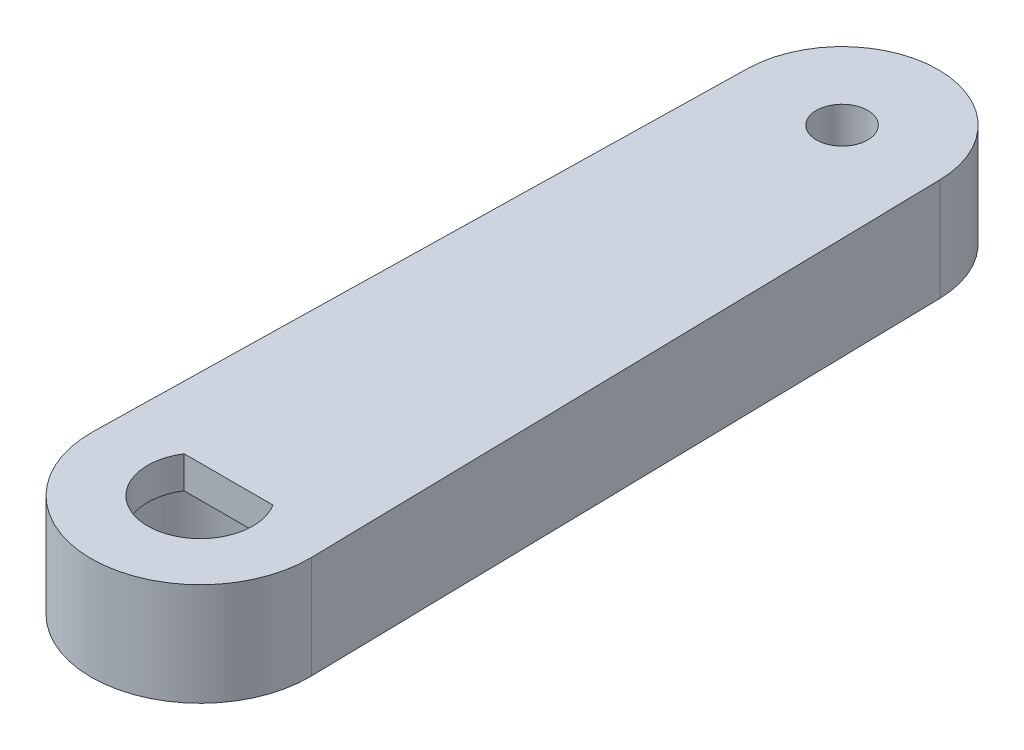
ISO-10303-21;
HEADER;
FILE_DESCRIPTION(('STEP AP214'),'2;1');
FILE_NAME('part.step','',(''),(''),'','','');
FILE_SCHEMA(('AUTOMOTIVE_DESIGN { 1 0 10303 214 1 1 1 1 }'));
ENDSEC;
DATA;
#1=APPLICATION_CONTEXT('core data for automotive mechanical design processes');
#2=APPLICATION_PROTOCOL_DEFINITION('international standard','automotive_design',2000,#1);
#3=PRODUCT_CONTEXT('',#1,'mechanical');
#4=PRODUCT('Part','Part','',(#3));
#5=PRODUCT_RELATED_PRODUCT_CATEGORY('part','',(#4));
#6=PRODUCT_DEFINITION_FORMATION('','',#4);
#7=PRODUCT_DEFINITION_CONTEXT('part definition',#1,'design');
#8=PRODUCT_DEFINITION('design','',#6,#7);
#9=PRODUCT_DEFINITION_SHAPE('','',#8);
#10=(LENGTH_UNIT() NAMED_UNIT(*) SI_UNIT(.MILLI.,.METRE.));
#11=(NAMED_UNIT(*) PLANE_ANGLE_UNIT() SI_UNIT($,.RADIAN.));
#12=(NAMED_UNIT(*) SI_UNIT($,.STERADIAN.) SOLID_ANGLE_UNIT());
#13=UNCERTAINTY_MEASURE_WITH_UNIT(LENGTH_MEASURE(1.E-05),#10,'distance_accuracy_value','');
#14=(GEOMETRIC_REPRESENTATION_CONTEXT(3) GLOBAL_UNCERTAINTY_ASSIGNED_CONTEXT((#13)) GLOBAL_UNIT_ASSIGNED_CONTEXT((#10,
#11,#12)) REPRESENTATION_CONTEXT('',''));
#15=CARTESIAN_POINT('',(0.,0.,0.));
#16=DIRECTION('',(0.,0.,1.));
#17=DIRECTION('',(1.,0.,0.));
#18=AXIS2_PLACEMENT_3D('',#15,#16,#17);
#19=CARTESIAN_POINT('',(0.,0.,0.));
#20=DIRECTION('',(0.,1.,0.));
#21=DIRECTION('',(0.,0.,1.));
#22=AXIS2_PLACEMENT_3D('',#19,#20,#21);
#23=PLANE('',#22);
#24=CARTESIAN_POINT('',(0.,0.,-25.));
#25=DIRECTION('',(0.,1.,0.));
#26=DIRECTION('',(0.,0.,1.));
#27=AXIS2_PLACEMENT_3D('',#24,#25,#26);
#28=CIRCLE('',#27,1.);
#29=CARTESIAN_POINT('',(0.,0.,-24.));
#30=VERTEX_POINT('',#29);
#31=EDGE_CURVE('E217',#30,#30,#28,.T.);
#32=ORIENTED_EDGE('',*,*,#31,.T.);
#33=EDGE_LOOP('',(#32));
#34=FACE_BOUND('',#33,.T.);
#35=DIRECTION('',(0.02,0.,-0.999799979995999));
#36=VECTOR('',#35,1.);
#37=CARTESIAN_POINT('',(-4.249149914983,0.,-0.085));
#38=LINE('',#37,#36);
#39=CARTESIAN_POINT('',(-4.249149914983,0.,-0.0849999999999997));
#40=VERTEX_POINT('',#39);
#41=CARTESIAN_POINT('',(-3.749249924985,0.,-25.075));
#42=VERTEX_POINT('',#41);
#43=EDGE_CURVE('E202',#40,#42,#38,.T.);
#44=ORIENTED_EDGE('',*,*,#43,.T.);
#45=CARTESIAN_POINT('',(0.,0.,-25.));
#46=DIRECTION('',(0.,1.,0.));
#47=DIRECTION('',(0.,0.,1.));
#48=AXIS2_PLACEMENT_3D('',#45,#46,#47);
#49=CIRCLE('',#48,3.75);
#50=CARTESIAN_POINT('',(3.749249924985,0.,-25.075));
#51=VERTEX_POINT('',#50);
#52=EDGE_CURVE('E240',#51,#42,#49,.T.);
#53=ORIENTED_EDGE('',*,*,#52,.F.);
#54=DIRECTION('',(-0.02,0.,-0.999799979995999));
#55=VECTOR('',#54,1.);
#56=CARTESIAN_POINT('',(4.249149914983,0.,-0.085));
#57=LINE('',#56,#55);
#58=CARTESIAN_POINT('',(4.249149914983,0.,-0.0849999999999997));
#59=VERTEX_POINT('',#58);
#60=EDGE_CURVE('E237',#59,#51,#57,.T.);
#61=ORIENTED_EDGE('',*,*,#60,.F.);
#62=CARTESIAN_POINT('',(0.,0.,0.));
#63=DIRECTION('',(0.,1.,0.));
#64=DIRECTION('',(0.,0.,1.));
#65=AXIS2_PLACEMENT_3D('',#62,#63,#64);
#66=CIRCLE('',#65,4.25);
#67=EDGE_CURVE('E234',#40,#59,#66,.T.);
#68=ORIENTED_EDGE('',*,*,#67,.F.);
#69=EDGE_LOOP('',(#44,#53,#61,#68));
#70=FACE_BOUND('',#69,.T.);
#71=CARTESIAN_POINT('',(0.,0.,0.));
#72=DIRECTION('',(0.,-1.,0.));
#73=DIRECTION('',(0.,0.,-1.));
#74=AXIS2_PLACEMENT_3D('',#71,#72,#73);
#75=CIRCLE('',#74,2.85);
#76=CARTESIAN_POINT('',(2.15,0.,-1.87082869338697));
#77=VERTEX_POINT('',#76);
#78=CARTESIAN_POINT('',(2.85,0.,0.));
#79=VERTEX_POINT('',#78);
#80=EDGE_CURVE('E161',#77,#79,#75,.F.);
#81=ORIENTED_EDGE('',*,*,#80,.T.);
#82=DIRECTION('',(0.,0.,-1.));
#83=VECTOR('',#82,1.);
#84=CARTESIAN_POINT('',(2.85,0.,0.));
#85=LINE('',#84,#83);
#86=CARTESIAN_POINT('',(2.85,0.,-15.));
#87=VERTEX_POINT('',#86);
#88=EDGE_CURVE('E172',#79,#87,#85,.T.);
#89=ORIENTED_EDGE('',*,*,#88,.T.);
#90=DIRECTION('',(1.,0.,0.));
#91=VECTOR('',#90,1.);
#92=CARTESIAN_POINT('',(0.,0.,-15.));
#93=LINE('',#92,#91);
#94=CARTESIAN_POINT('',(2.15,0.,-15.));
#95=VERTEX_POINT('',#94);
#96=EDGE_CURVE('E191',#95,#87,#93,.T.);
#97=ORIENTED_EDGE('',*,*,#96,.F.);
#98=DIRECTION('',(0.,0.,-1.));
#99=VECTOR('',#98,1.);
#100=CARTESIAN_POINT('',(2.15,0.,0.));
#101=LINE('',#100,#99);
#102=EDGE_CURVE('E187',#77,#95,#101,.T.);
#103=ORIENTED_EDGE('',*,*,#102,.F.);
#104=EDGE_LOOP('',(#81,#89,#97,#103));
#105=FACE_BOUND('',#104,.T.);
#106=ADVANCED_FACE('F41',(#34,#70,#105),#23,.F.);
#107=CARTESIAN_POINT('',(-4.249149914983,4.,-0.085));
#108=DIRECTION('',(-0.999799979995999,0.,-0.02));
#109=DIRECTION('',(-0.02,0.,0.999799979995999));
#110=AXIS2_PLACEMENT_3D('',#107,#108,#109);
#111=PLANE('',#110);
#112=ORIENTED_EDGE('',*,*,#43,.F.);
#113=DIRECTION('',(0.,-1.,0.));
#114=VECTOR('',#113,1.);
#115=CARTESIAN_POINT('',(-4.249149914983,4.,-0.0849999999999997));
#116=LINE('',#115,#114);
#117=CARTESIAN_POINT('',(-4.249149914983,4.,-0.0849999999999997));
#118=VERTEX_POINT('',#117);
#119=EDGE_CURVE('E257',#118,#40,#116,.T.);
#120=ORIENTED_EDGE('',*,*,#119,.F.);
#121=DIRECTION('',(0.02,0.,-0.999799979995999));
#122=VECTOR('',#121,1.);
#123=CARTESIAN_POINT('',(-4.249149914983,4.,-0.085));
#124=LINE('',#123,#122);
#125=CARTESIAN_POINT('',(-3.749249924985,4.,-25.075));
#126=VERTEX_POINT('',#125);
#127=EDGE_CURVE('E212',#118,#126,#124,.T.);
#128=ORIENTED_EDGE('',*,*,#127,.T.);
#129=DIRECTION('',(0.,-1.,0.));
#130=VECTOR('',#129,1.);
#131=CARTESIAN_POINT('',(-3.749249924985,4.,-25.075));
#132=LINE('',#131,#130);
#133=EDGE_CURVE('E230',#126,#42,#132,.T.);
#134=ORIENTED_EDGE('',*,*,#133,.T.);
#135=EDGE_LOOP('',(#112,#120,#128,#134));
#136=FACE_BOUND('',#135,.T.);
#137=ADVANCED_FACE('F43',(#136),#111,.T.);
#138=CARTESIAN_POINT('',(0.,4.,0.));
#139=DIRECTION('',(0.,-1.,0.));
#140=DIRECTION('',(0.,0.,-1.));
#141=AXIS2_PLACEMENT_3D('',#138,#139,#140);
#142=CYLINDRICAL_SURFACE('',#141,4.25);
#143=ORIENTED_EDGE('',*,*,#67,.T.);
#144=DIRECTION('',(0.,-1.,0.));
#145=VECTOR('',#144,1.);
#146=CARTESIAN_POINT('',(4.249149914983,4.,-0.0849999999999997));
#147=LINE('',#146,#145);
#148=CARTESIAN_POINT('',(4.249149914983,4.,-0.0849999999999997));
#149=VERTEX_POINT('',#148);
#150=EDGE_CURVE('E253',#149,#59,#147,.T.);
#151=ORIENTED_EDGE('',*,*,#150,.F.);
#152=CARTESIAN_POINT('',(0.,4.,0.));
#153=DIRECTION('',(0.,1.,0.));
#154=DIRECTION('',(0.,0.,1.));
#155=AXIS2_PLACEMENT_3D('',#152,#153,#154);
#156=CIRCLE('',#155,4.25);
#157=EDGE_CURVE('E216',#118,#149,#156,.T.);
#158=ORIENTED_EDGE('',*,*,#157,.F.);
#159=ORIENTED_EDGE('',*,*,#119,.T.);
#160=EDGE_LOOP('',(#143,#151,#158,#159));
#161=FACE_BOUND('',#160,.T.);
#162=ADVANCED_FACE('F325',(#161),#142,.T.);
#163=CARTESIAN_POINT('',(4.249149914983,4.,-0.085));
#164=DIRECTION('',(-0.999799979995999,0.,0.02));
#165=DIRECTION('',(0.02,0.,0.999799979995999));
#166=AXIS2_PLACEMENT_3D('',#163,#164,#165);
#167=PLANE('',#166);
#168=ORIENTED_EDGE('',*,*,#60,.T.);
#169=DIRECTION('',(0.,-1.,0.));
#170=VECTOR('',#169,1.);
#171=CARTESIAN_POINT('',(3.749249924985,4.,-25.075));
#172=LINE('',#171,#170);
#173=CARTESIAN_POINT('',(3.749249924985,4.,-25.075));
#174=VERTEX_POINT('',#173);
#175=EDGE_CURVE('E249',#174,#51,#172,.T.);
#176=ORIENTED_EDGE('',*,*,#175,.F.);
#177=DIRECTION('',(-0.02,0.,-0.999799979995999));
#178=VECTOR('',#177,1.);
#179=CARTESIAN_POINT('',(4.249149914983,4.,-0.085));
#180=LINE('',#179,#178);
#181=EDGE_CURVE('E220',#149,#174,#180,.T.);
#182=ORIENTED_EDGE('',*,*,#181,.F.);
#183=ORIENTED_EDGE('',*,*,#150,.T.);
#184=EDGE_LOOP('',(#168,#176,#182,#183));
#185=FACE_BOUND('',#184,.T.);
#186=ADVANCED_FACE('F322',(#185),#167,.F.);
#187=CARTESIAN_POINT('',(0.,4.,-25.));
#188=DIRECTION('',(0.,-1.,0.));
#189=DIRECTION('',(0.,0.,-1.));
#190=AXIS2_PLACEMENT_3D('',#187,#188,#189);
#191=CYLINDRICAL_SURFACE('',#190,3.75);
#192=ORIENTED_EDGE('',*,*,#52,.T.);
#193=ORIENTED_EDGE('',*,*,#133,.F.);
#194=CARTESIAN_POINT('',(0.,4.,-25.));
#195=DIRECTION('',(0.,1.,0.));
#196=DIRECTION('',(0.,0.,1.));
#197=AXIS2_PLACEMENT_3D('',#194,#195,#196);
#198=CIRCLE('',#197,3.75);
#199=EDGE_CURVE('E223',#174,#126,#198,.T.);
#200=ORIENTED_EDGE('',*,*,#199,.F.);
#201=ORIENTED_EDGE('',*,*,#175,.T.);
#202=EDGE_LOOP('',(#192,#193,#200,#201));
#203=FACE_BOUND('',#202,.T.);
#204=ADVANCED_FACE('F283',(#203),#191,.T.);
#205=CARTESIAN_POINT('',(0.,4.,-25.));
#206=DIRECTION('',(0.,-1.,0.));
#207=DIRECTION('',(0.,0.,-1.));
#208=AXIS2_PLACEMENT_3D('',#205,#206,#207);
#209=CYLINDRICAL_SURFACE('',#208,1.);
#210=CARTESIAN_POINT('',(0.,4.,-25.));
#211=DIRECTION('',(0.,1.,0.));
#212=DIRECTION('',(0.,0.,1.));
#213=AXIS2_PLACEMENT_3D('',#210,#211,#212);
#214=CIRCLE('',#213,1.);
#215=CARTESIAN_POINT('',(0.,4.,-24.));
#216=VERTEX_POINT('',#215);
#217=EDGE_CURVE('E226',#216,#216,#214,.T.);
#218=ORIENTED_EDGE('',*,*,#217,.T.);
#219=EDGE_LOOP('',(#218));
#220=FACE_BOUND('',#219,.T.);
#221=ORIENTED_EDGE('',*,*,#31,.F.);
#222=EDGE_LOOP('',(#221));
#223=FACE_BOUND('',#222,.T.);
#224=ADVANCED_FACE('F275',(#220,#223),#209,.F.);
#225=CARTESIAN_POINT('',(0.,4.,0.));
#226=DIRECTION('',(0.,1.,0.));
#227=DIRECTION('',(0.,0.,1.));
#228=AXIS2_PLACEMENT_3D('',#225,#226,#227);
#229=PLANE('',#228);
#230=CARTESIAN_POINT('',(0.,4.,0.));
#231=DIRECTION('',(0.,1.,0.));
#232=DIRECTION('',(0.,0.,1.));
#233=AXIS2_PLACEMENT_3D('',#230,#231,#232);
#234=CIRCLE('',#233,2.05);
#235=CARTESIAN_POINT('',(1.45905324883325,4.,1.44002208909069));
#236=VERTEX_POINT('',#235);
#237=CARTESIAN_POINT('',(1.72988438920062,4.,-1.1));
#238=VERTEX_POINT('',#237);
#239=EDGE_CURVE('E11',#236,#238,#234,.T.);
#240=ORIENTED_EDGE('',*,*,#239,.F.);
#241=DIRECTION('',(-0.705318010544101,0.,0.708891038173083));
#242=VECTOR('',#241,1.);
#243=CARTESIAN_POINT('',(1.45321478079441,4.,1.44589013386982));
#244=LINE('',#243,#242);
#245=CARTESIAN_POINT('',(1.44737631275555,4.,1.45175817864896));
#246=VERTEX_POINT('',#245);
#247=EDGE_CURVE('E135',#236,#246,#244,.T.);
#248=ORIENTED_EDGE('',*,*,#247,.T.);
#249=CARTESIAN_POINT('',(0.,4.,0.));
#250=DIRECTION('',(0.,1.,0.));
#251=DIRECTION('',(0.,0.,1.));
#252=AXIS2_PLACEMENT_3D('',#249,#250,#251);
#253=CIRCLE('',#252,2.05);
#254=CARTESIAN_POINT('',(-1.72988438920062,4.,-1.1));
#255=VERTEX_POINT('',#254);
#256=EDGE_CURVE('E262',#255,#246,#253,.T.);
#257=ORIENTED_EDGE('',*,*,#256,.F.);
#258=DIRECTION('',(-1.,0.,0.));
#259=VECTOR('',#258,1.);
#260=CARTESIAN_POINT('',(0.,4.,-1.1));
#261=LINE('',#260,#259);
#262=EDGE_CURVE('E50',#238,#255,#261,.T.);
#263=ORIENTED_EDGE('',*,*,#262,.F.);
#264=EDGE_LOOP('',(#240,#248,#257,#263));
#265=FACE_BOUND('',#264,.T.);
#266=ORIENTED_EDGE('',*,*,#127,.F.);
#267=ORIENTED_EDGE('',*,*,#157,.T.);
#268=ORIENTED_EDGE('',*,*,#181,.T.);
#269=ORIENTED_EDGE('',*,*,#199,.T.);
#270=EDGE_LOOP('',(#266,#267,#268,#269));
#271=FACE_BOUND('',#270,.T.);
#272=ORIENTED_EDGE('',*,*,#217,.F.);
#273=EDGE_LOOP('',(#272));
#274=FACE_BOUND('',#273,.T.);
#275=ADVANCED_FACE('F271',(#265,#271,#274),#229,.T.);
#276=CARTESIAN_POINT('',(0.,2.75,0.));
#277=DIRECTION('',(0.,-1.,0.));
#278=DIRECTION('',(0.,0.,-1.));
#279=AXIS2_PLACEMENT_3D('',#276,#277,#278);
#280=CYLINDRICAL_SURFACE('',#279,2.85);
#281=ORIENTED_EDGE('',*,*,#80,.F.);
#282=DIRECTION('',(0.,-1.,0.));
#283=VECTOR('',#282,1.);
#284=CARTESIAN_POINT('',(2.15,2.75,-1.87082869338697));
#285=LINE('',#284,#283);
#286=CARTESIAN_POINT('',(2.15,2.75,-1.87082869338697));
#287=VERTEX_POINT('',#286);
#288=EDGE_CURVE('E183',#287,#77,#285,.T.);
#289=ORIENTED_EDGE('',*,*,#288,.F.);
#290=CARTESIAN_POINT('',(0.,2.75,0.));
#291=DIRECTION('',(0.,-1.,0.));
#292=DIRECTION('',(0.,0.,-1.));
#293=AXIS2_PLACEMENT_3D('',#290,#291,#292);
#294=CIRCLE('',#293,2.85);
#295=CARTESIAN_POINT('',(2.85,2.75,0.));
#296=VERTEX_POINT('',#295);
#297=EDGE_CURVE('E167',#287,#296,#294,.F.);
#298=ORIENTED_EDGE('',*,*,#297,.T.);
#299=DIRECTION('',(0.,-1.,0.));
#300=VECTOR('',#299,1.);
#301=CARTESIAN_POINT('',(2.85,2.75,0.));
#302=LINE('',#301,#300);
#303=EDGE_CURVE('E198',#296,#79,#302,.T.);
#304=ORIENTED_EDGE('',*,*,#303,.T.);
#305=EDGE_LOOP('',(#281,#289,#298,#304));
#306=FACE_BOUND('',#305,.T.);
#307=ADVANCED_FACE('F274',(#306),#280,.F.);
#308=CARTESIAN_POINT('',(2.85,2.75,0.));
#309=DIRECTION('',(-1.,0.,0.));
#310=DIRECTION('',(0.,0.,1.));
#311=AXIS2_PLACEMENT_3D('',#308,#309,#310);
#312=PLANE('',#311);
#313=ORIENTED_EDGE('',*,*,#88,.F.);
#314=ORIENTED_EDGE('',*,*,#303,.F.);
#315=DIRECTION('',(0.,0.,-1.));
#316=VECTOR('',#315,1.);
#317=CARTESIAN_POINT('',(2.85,2.75,0.));
#318=LINE('',#317,#316);
#319=CARTESIAN_POINT('',(2.85,2.75,-15.));
#320=VERTEX_POINT('',#319);
#321=EDGE_CURVE('E180',#296,#320,#318,.T.);
#322=ORIENTED_EDGE('',*,*,#321,.T.);
#323=DIRECTION('',(0.,-1.,0.));
#324=VECTOR('',#323,1.);
#325=CARTESIAN_POINT('',(2.85,2.75,-15.));
#326=LINE('',#325,#324);
#327=EDGE_CURVE('E203',#320,#87,#326,.T.);
#328=ORIENTED_EDGE('',*,*,#327,.T.);
#329=EDGE_LOOP('',(#313,#314,#322,#328));
#330=FACE_BOUND('',#329,.T.);
#331=ADVANCED_FACE('F304',(#330),#312,.T.);
#332=CARTESIAN_POINT('',(0.,2.75,-15.));
#333=DIRECTION('',(0.,0.,-1.));
#334=DIRECTION('',(-1.,0.,0.));
#335=AXIS2_PLACEMENT_3D('',#332,#333,#334);
#336=PLANE('',#335);
#337=ORIENTED_EDGE('',*,*,#96,.T.);
#338=ORIENTED_EDGE('',*,*,#327,.F.);
#339=DIRECTION('',(1.,0.,0.));
#340=VECTOR('',#339,1.);
#341=CARTESIAN_POINT('',(0.,2.75,-15.));
#342=LINE('',#341,#340);
#343=CARTESIAN_POINT('',(2.15,2.75,-15.));
#344=VERTEX_POINT('',#343);
#345=EDGE_CURVE('E176',#344,#320,#342,.T.);
#346=ORIENTED_EDGE('',*,*,#345,.F.);
#347=DIRECTION('',(0.,-1.,0.));
#348=VECTOR('',#347,1.);
#349=CARTESIAN_POINT('',(2.15,2.75,-15.));
#350=LINE('',#349,#348);
#351=EDGE_CURVE('E206',#344,#95,#350,.T.);
#352=ORIENTED_EDGE('',*,*,#351,.T.);
#353=EDGE_LOOP('',(#337,#338,#346,#352));
#354=FACE_BOUND('',#353,.T.);
#355=ADVANCED_FACE('F307',(#354),#336,.F.);
#356=CARTESIAN_POINT('',(2.15,2.75,0.));
#357=DIRECTION('',(-1.,0.,0.));
#358=DIRECTION('',(0.,0.,1.));
#359=AXIS2_PLACEMENT_3D('',#356,#357,#358);
#360=PLANE('',#359);
#361=ORIENTED_EDGE('',*,*,#102,.T.);
#362=ORIENTED_EDGE('',*,*,#351,.F.);
#363=DIRECTION('',(0.,0.,-1.));
#364=VECTOR('',#363,1.);
#365=CARTESIAN_POINT('',(2.15,2.75,0.));
#366=LINE('',#365,#364);
#367=EDGE_CURVE('E171',#287,#344,#366,.T.);
#368=ORIENTED_EDGE('',*,*,#367,.F.);
#369=ORIENTED_EDGE('',*,*,#288,.T.);
#370=EDGE_LOOP('',(#361,#362,#368,#369));
#371=FACE_BOUND('',#370,.T.);
#372=ADVANCED_FACE('F301',(#371),#360,.F.);
#373=CARTESIAN_POINT('',(0.,2.75,0.));
#374=DIRECTION('',(0.,-1.,0.));
#375=DIRECTION('',(0.,0.,-1.));
#376=AXIS2_PLACEMENT_3D('',#373,#374,#375);
#377=PLANE('',#376);
#378=CARTESIAN_POINT('',(0.,2.75,0.));
#379=DIRECTION('',(0.,-1.,0.));
#380=DIRECTION('',(0.,0.,-1.));
#381=AXIS2_PLACEMENT_3D('',#378,#379,#380);
#382=CIRCLE('',#381,2.05);
#383=CARTESIAN_POINT('',(1.72988438920062,2.75,-1.1));
#384=VERTEX_POINT('',#383);
#385=CARTESIAN_POINT('',(1.45905324883325,2.75,1.44002208909069));
#386=VERTEX_POINT('',#385);
#387=EDGE_CURVE('E142',#384,#386,#382,.T.);
#388=ORIENTED_EDGE('',*,*,#387,.F.);
#389=DIRECTION('',(1.,0.,0.));
#390=VECTOR('',#389,1.);
#391=CARTESIAN_POINT('',(0.,2.75,-1.1));
#392=LINE('',#391,#390);
#393=CARTESIAN_POINT('',(-1.72988438920062,2.75,-1.1));
#394=VERTEX_POINT('',#393);
#395=EDGE_CURVE('E139',#394,#384,#392,.T.);
#396=ORIENTED_EDGE('',*,*,#395,.F.);
#397=CARTESIAN_POINT('',(1.44737631275555,2.75,1.45175817864896));
#398=VERTEX_POINT('',#397);
#399=EDGE_CURVE('E57',#398,#394,#382,.T.);
#400=ORIENTED_EDGE('',*,*,#399,.F.);
#401=DIRECTION('',(0.705318010544101,0.,-0.708891038173083));
#402=VECTOR('',#401,1.);
#403=CARTESIAN_POINT('',(1.45321478079441,2.75,1.44589013386982));
#404=LINE('',#403,#402);
#405=EDGE_CURVE('E133',#398,#386,#404,.T.);
#406=ORIENTED_EDGE('',*,*,#405,.T.);
#407=EDGE_LOOP('',(#388,#396,#400,#406));
#408=FACE_BOUND('',#407,.T.);
#409=ORIENTED_EDGE('',*,*,#297,.F.);
#410=ORIENTED_EDGE('',*,*,#367,.T.);
#411=ORIENTED_EDGE('',*,*,#345,.T.);
#412=ORIENTED_EDGE('',*,*,#321,.F.);
#413=EDGE_LOOP('',(#409,#410,#411,#412));
#414=FACE_BOUND('',#413,.T.);
#415=ADVANCED_FACE('F151',(#408,#414),#377,.T.);
#416=CARTESIAN_POINT('',(0.,12.75,0.));
#417=DIRECTION('',(0.,-1.,0.));
#418=DIRECTION('',(0.,0.,-1.));
#419=AXIS2_PLACEMENT_3D('',#416,#417,#418);
#420=CYLINDRICAL_SURFACE('',#419,2.05);
#421=ORIENTED_EDGE('',*,*,#239,.T.);
#422=DIRECTION('',(0.,-1.,0.));
#423=VECTOR('',#422,1.);
#424=CARTESIAN_POINT('',(1.72988438920062,12.75,-1.1));
#425=LINE('',#424,#423);
#426=EDGE_CURVE('E145',#238,#384,#425,.T.);
#427=ORIENTED_EDGE('',*,*,#426,.T.);
#428=ORIENTED_EDGE('',*,*,#387,.T.);
#429=DIRECTION('',(0.,-1.,0.));
#430=VECTOR('',#429,1.);
#431=CARTESIAN_POINT('',(1.45905324883325,12.75,1.44002208909069));
#432=LINE('',#431,#430);
#433=EDGE_CURVE('E129',#236,#386,#432,.T.);
#434=ORIENTED_EDGE('',*,*,#433,.F.);
#435=EDGE_LOOP('',(#421,#427,#428,#434));
#436=FACE_BOUND('',#435,.T.);
#437=ADVANCED_FACE('F143',(#436),#420,.F.);
#438=CARTESIAN_POINT('',(0.,12.75,-1.1));
#439=DIRECTION('',(0.,0.,-1.));
#440=DIRECTION('',(-1.,0.,0.));
#441=AXIS2_PLACEMENT_3D('',#438,#439,#440);
#442=PLANE('',#441);
#443=ORIENTED_EDGE('',*,*,#262,.T.);
#444=DIRECTION('',(0.,-1.,0.));
#445=VECTOR('',#444,1.);
#446=CARTESIAN_POINT('',(-1.72988438920062,12.75,-1.1));
#447=LINE('',#446,#445);
#448=EDGE_CURVE('E162',#255,#394,#447,.T.);
#449=ORIENTED_EDGE('',*,*,#448,.T.);
#450=ORIENTED_EDGE('',*,*,#395,.T.);
#451=ORIENTED_EDGE('',*,*,#426,.F.);
#452=EDGE_LOOP('',(#443,#449,#450,#451));
#453=FACE_BOUND('',#452,.T.);
#454=ADVANCED_FACE('F267',(#453),#442,.F.);
#455=ORIENTED_EDGE('',*,*,#256,.T.);
#456=DIRECTION('',(0.,-1.,0.));
#457=VECTOR('',#456,1.);
#458=CARTESIAN_POINT('',(1.44737631275555,12.75,1.45175817864896));
#459=LINE('',#458,#457);
#460=EDGE_CURVE('E64',#246,#398,#459,.T.);
#461=ORIENTED_EDGE('',*,*,#460,.T.);
#462=ORIENTED_EDGE('',*,*,#399,.T.);
#463=ORIENTED_EDGE('',*,*,#448,.F.);
#464=EDGE_LOOP('',(#455,#461,#462,#463));
#465=FACE_BOUND('',#464,.T.);
#466=ADVANCED_FACE('F270',(#465),#420,.F.);
#467=CARTESIAN_POINT('',(1.45321478079441,12.75,1.44589013386982));
#468=DIRECTION('',(-0.708891038173083,0.,-0.705318010544101));
#469=DIRECTION('',(-0.705318010544101,0.,0.708891038173083));
#470=AXIS2_PLACEMENT_3D('',#467,#468,#469);
#471=PLANE('',#470);
#472=ORIENTED_EDGE('',*,*,#433,.T.);
#473=ORIENTED_EDGE('',*,*,#405,.F.);
#474=ORIENTED_EDGE('',*,*,#460,.F.);
#475=ORIENTED_EDGE('',*,*,#247,.F.);
#476=EDGE_LOOP('',(#472,#473,#474,#475));
#477=FACE_BOUND('',#476,.T.);
#478=ADVANCED_FACE('F131',(#477),#471,.T.);
#479=CLOSED_SHELL('',(#106,#137,#162,#186,#204,#224,#275,#307,#331,#355,#372,#415,#437,#454,
#466,#478));
#480=MANIFOLD_SOLID_BREP('B2',#479);
#481=ADVANCED_BREP_SHAPE_REPRESENTATION('',(#18,#480),#14);
#482=SHAPE_DEFINITION_REPRESENTATION(#9,#481);
ENDSEC;
END-ISO-10303-21;
